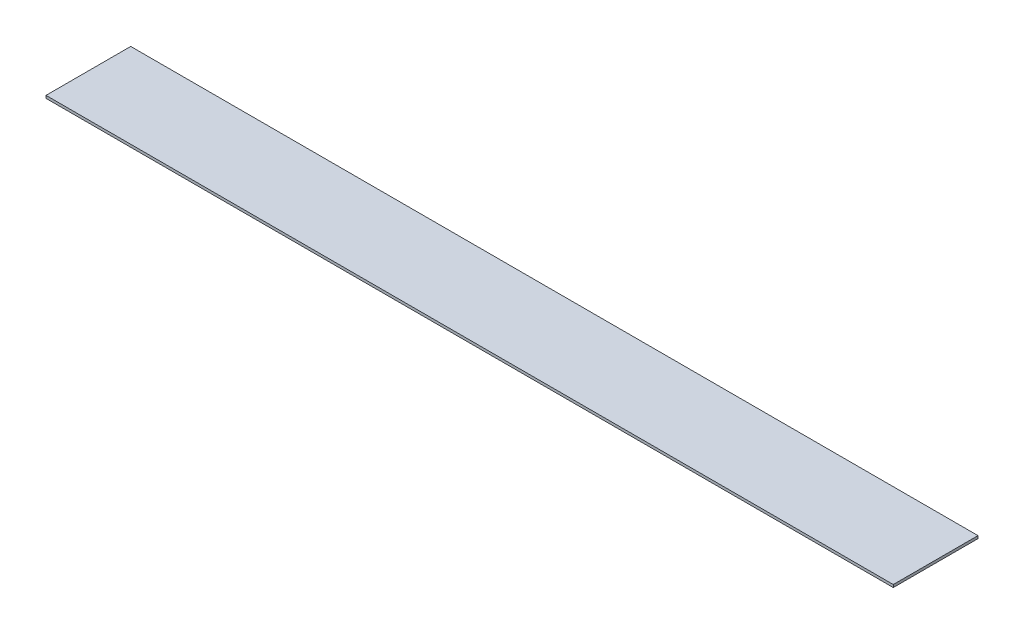
ISO-10303-21;
HEADER;
FILE_DESCRIPTION(('STEP AP214'),'2;1');
FILE_NAME('part.step','',(''),(''),'','','');
FILE_SCHEMA(('AUTOMOTIVE_DESIGN { 1 0 10303 214 1 1 1 1 }'));
ENDSEC;
DATA;
#1=APPLICATION_CONTEXT('core data for automotive mechanical design processes');
#2=APPLICATION_PROTOCOL_DEFINITION('international standard','automotive_design',2000,#1);
#3=PRODUCT_CONTEXT('',#1,'mechanical');
#4=PRODUCT('Part','Part','',(#3));
#5=PRODUCT_RELATED_PRODUCT_CATEGORY('part','',(#4));
#6=PRODUCT_DEFINITION_FORMATION('','',#4);
#7=PRODUCT_DEFINITION_CONTEXT('part definition',#1,'design');
#8=PRODUCT_DEFINITION('design','',#6,#7);
#9=PRODUCT_DEFINITION_SHAPE('','',#8);
#10=(LENGTH_UNIT() NAMED_UNIT(*) SI_UNIT(.MILLI.,.METRE.));
#11=(NAMED_UNIT(*) PLANE_ANGLE_UNIT() SI_UNIT($,.RADIAN.));
#12=(NAMED_UNIT(*) SI_UNIT($,.STERADIAN.) SOLID_ANGLE_UNIT());
#13=UNCERTAINTY_MEASURE_WITH_UNIT(LENGTH_MEASURE(1.E-05),#10,'distance_accuracy_value','');
#14=(GEOMETRIC_REPRESENTATION_CONTEXT(3) GLOBAL_UNCERTAINTY_ASSIGNED_CONTEXT((#13)) GLOBAL_UNIT_ASSIGNED_CONTEXT((#10,
#11,#12)) REPRESENTATION_CONTEXT('',''));
#15=CARTESIAN_POINT('',(0.,0.,0.));
#16=DIRECTION('',(0.,0.,1.));
#17=DIRECTION('',(1.,0.,0.));
#18=AXIS2_PLACEMENT_3D('',#15,#16,#17);
#19=CARTESIAN_POINT('',(0.,-1.5875,0.));
#20=DIRECTION('',(1.,0.,0.));
#21=DIRECTION('',(0.,0.,-1.));
#22=AXIS2_PLACEMENT_3D('',#19,#20,#21);
#23=PLANE('',#22);
#24=DIRECTION('',(0.,0.,-1.));
#25=VECTOR('',#24,1.);
#26=CARTESIAN_POINT('',(0.,0.,0.));
#27=LINE('',#26,#25);
#28=CARTESIAN_POINT('',(0.,0.,50.8));
#29=VERTEX_POINT('',#28);
#30=CARTESIAN_POINT('',(0.,0.,0.));
#31=VERTEX_POINT('',#30);
#32=EDGE_CURVE('E98',#29,#31,#27,.T.);
#33=ORIENTED_EDGE('',*,*,#32,.T.);
#34=DIRECTION('',(0.,1.,0.));
#35=VECTOR('',#34,1.);
#36=CARTESIAN_POINT('',(0.,-1.5875,0.));
#37=LINE('',#36,#35);
#38=CARTESIAN_POINT('',(0.,-1.5875,0.));
#39=VERTEX_POINT('',#38);
#40=EDGE_CURVE('E11',#39,#31,#37,.T.);
#41=ORIENTED_EDGE('',*,*,#40,.F.);
#42=DIRECTION('',(0.,0.,-1.));
#43=VECTOR('',#42,1.);
#44=CARTESIAN_POINT('',(0.,-1.5875,0.));
#45=LINE('',#44,#43);
#46=CARTESIAN_POINT('',(0.,-1.5875,50.8));
#47=VERTEX_POINT('',#46);
#48=EDGE_CURVE('E86',#47,#39,#45,.T.);
#49=ORIENTED_EDGE('',*,*,#48,.F.);
#50=DIRECTION('',(0.,1.,0.));
#51=VECTOR('',#50,1.);
#52=CARTESIAN_POINT('',(0.,-1.5875,50.8));
#53=LINE('',#52,#51);
#54=EDGE_CURVE('E94',#47,#29,#53,.T.);
#55=ORIENTED_EDGE('',*,*,#54,.T.);
#56=EDGE_LOOP('',(#33,#41,#49,#55));
#57=FACE_BOUND('',#56,.T.);
#58=ADVANCED_FACE('F35',(#57),#23,.F.);
#59=CARTESIAN_POINT('',(0.,-1.5875,0.));
#60=DIRECTION('',(0.,0.,1.));
#61=DIRECTION('',(1.,0.,0.));
#62=AXIS2_PLACEMENT_3D('',#59,#60,#61);
#63=PLANE('',#62);
#64=DIRECTION('',(1.,0.,0.));
#65=VECTOR('',#64,1.);
#66=CARTESIAN_POINT('',(0.,0.,0.));
#67=LINE('',#66,#65);
#68=CARTESIAN_POINT('',(508.,0.,0.));
#69=VERTEX_POINT('',#68);
#70=EDGE_CURVE('E90',#31,#69,#67,.T.);
#71=ORIENTED_EDGE('',*,*,#70,.T.);
#72=DIRECTION('',(0.,1.,0.));
#73=VECTOR('',#72,1.);
#74=CARTESIAN_POINT('',(508.,-1.5875,0.));
#75=LINE('',#74,#73);
#76=CARTESIAN_POINT('',(508.,-1.5875,0.));
#77=VERTEX_POINT('',#76);
#78=EDGE_CURVE('E43',#77,#69,#75,.T.);
#79=ORIENTED_EDGE('',*,*,#78,.F.);
#80=DIRECTION('',(1.,0.,0.));
#81=VECTOR('',#80,1.);
#82=CARTESIAN_POINT('',(0.,-1.5875,0.));
#83=LINE('',#82,#81);
#84=EDGE_CURVE('E81',#39,#77,#83,.T.);
#85=ORIENTED_EDGE('',*,*,#84,.F.);
#86=ORIENTED_EDGE('',*,*,#40,.T.);
#87=EDGE_LOOP('',(#71,#79,#85,#86));
#88=FACE_BOUND('',#87,.T.);
#89=ADVANCED_FACE('F89',(#88),#63,.F.);
#90=CARTESIAN_POINT('',(508.,-1.5875,0.));
#91=DIRECTION('',(-1.,0.,0.));
#92=DIRECTION('',(0.,0.,1.));
#93=AXIS2_PLACEMENT_3D('',#90,#91,#92);
#94=PLANE('',#93);
#95=DIRECTION('',(0.,0.,1.));
#96=VECTOR('',#95,1.);
#97=CARTESIAN_POINT('',(508.,0.,0.));
#98=LINE('',#97,#96);
#99=CARTESIAN_POINT('',(508.,0.,50.8));
#100=VERTEX_POINT('',#99);
#101=EDGE_CURVE('E68',#69,#100,#98,.T.);
#102=ORIENTED_EDGE('',*,*,#101,.T.);
#103=DIRECTION('',(0.,1.,0.));
#104=VECTOR('',#103,1.);
#105=CARTESIAN_POINT('',(508.,-1.5875,50.8));
#106=LINE('',#105,#104);
#107=CARTESIAN_POINT('',(508.,-1.5875,50.8));
#108=VERTEX_POINT('',#107);
#109=EDGE_CURVE('E91',#108,#100,#106,.T.);
#110=ORIENTED_EDGE('',*,*,#109,.F.);
#111=DIRECTION('',(0.,0.,1.));
#112=VECTOR('',#111,1.);
#113=CARTESIAN_POINT('',(508.,-1.5875,0.));
#114=LINE('',#113,#112);
#115=EDGE_CURVE('E84',#77,#108,#114,.T.);
#116=ORIENTED_EDGE('',*,*,#115,.F.);
#117=ORIENTED_EDGE('',*,*,#78,.T.);
#118=EDGE_LOOP('',(#102,#110,#116,#117));
#119=FACE_BOUND('',#118,.T.);
#120=ADVANCED_FACE('F92',(#119),#94,.F.);
#121=CARTESIAN_POINT('',(0.,-1.5875,50.8));
#122=DIRECTION('',(0.,0.,-1.));
#123=DIRECTION('',(-1.,0.,0.));
#124=AXIS2_PLACEMENT_3D('',#121,#122,#123);
#125=PLANE('',#124);
#126=DIRECTION('',(-1.,0.,0.));
#127=VECTOR('',#126,1.);
#128=CARTESIAN_POINT('',(0.,0.,50.8));
#129=LINE('',#128,#127);
#130=EDGE_CURVE('E74',#100,#29,#129,.T.);
#131=ORIENTED_EDGE('',*,*,#130,.T.);
#132=ORIENTED_EDGE('',*,*,#54,.F.);
#133=DIRECTION('',(-1.,0.,0.));
#134=VECTOR('',#133,1.);
#135=CARTESIAN_POINT('',(0.,-1.5875,50.8));
#136=LINE('',#135,#134);
#137=EDGE_CURVE('E51',#108,#47,#136,.T.);
#138=ORIENTED_EDGE('',*,*,#137,.F.);
#139=ORIENTED_EDGE('',*,*,#109,.T.);
#140=EDGE_LOOP('',(#131,#132,#138,#139));
#141=FACE_BOUND('',#140,.T.);
#142=ADVANCED_FACE('F105',(#141),#125,.F.);
#143=CARTESIAN_POINT('',(0.,-1.5875,0.));
#144=DIRECTION('',(0.,1.,0.));
#145=DIRECTION('',(0.,0.,1.));
#146=AXIS2_PLACEMENT_3D('',#143,#144,#145);
#147=PLANE('',#146);
#148=ORIENTED_EDGE('',*,*,#48,.T.);
#149=ORIENTED_EDGE('',*,*,#84,.T.);
#150=ORIENTED_EDGE('',*,*,#115,.T.);
#151=ORIENTED_EDGE('',*,*,#137,.T.);
#152=EDGE_LOOP('',(#148,#149,#150,#151));
#153=FACE_BOUND('',#152,.T.);
#154=ADVANCED_FACE('F82',(#153),#147,.F.);
#155=CARTESIAN_POINT('',(0.,0.,0.));
#156=DIRECTION('',(0.,1.,0.));
#157=DIRECTION('',(0.,0.,1.));
#158=AXIS2_PLACEMENT_3D('',#155,#156,#157);
#159=PLANE('',#158);
#160=ORIENTED_EDGE('',*,*,#32,.F.);
#161=ORIENTED_EDGE('',*,*,#130,.F.);
#162=ORIENTED_EDGE('',*,*,#101,.F.);
#163=ORIENTED_EDGE('',*,*,#70,.F.);
#164=EDGE_LOOP('',(#160,#161,#162,#163));
#165=FACE_BOUND('',#164,.T.);
#166=ADVANCED_FACE('F108',(#165),#159,.T.);
#167=CLOSED_SHELL('',(#58,#89,#120,#142,#154,#166));
#168=MANIFOLD_SOLID_BREP('B2',#167);
#169=ADVANCED_BREP_SHAPE_REPRESENTATION('',(#18,#168),#14);
#170=SHAPE_DEFINITION_REPRESENTATION(#9,#169);
ENDSEC;
END-ISO-10303-21;
